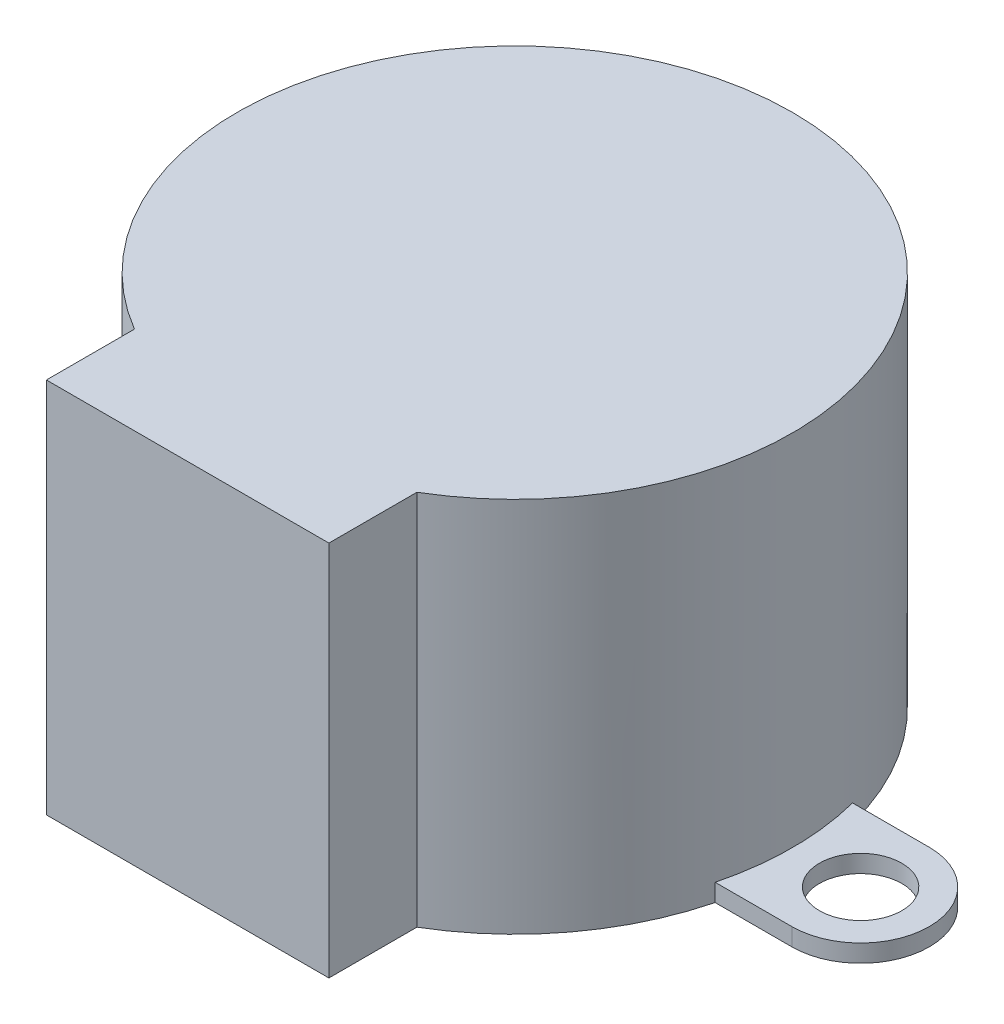
ISO-10303-21;
HEADER;
FILE_DESCRIPTION(('STEP AP214'),'2;1');
FILE_NAME('part.step','',(''),(''),'','','');
FILE_SCHEMA(('AUTOMOTIVE_DESIGN { 1 0 10303 214 1 1 1 1 }'));
ENDSEC;
DATA;
#1=APPLICATION_CONTEXT('core data for automotive mechanical design processes');
#2=APPLICATION_PROTOCOL_DEFINITION('international standard','automotive_design',2000,#1);
#3=PRODUCT_CONTEXT('',#1,'mechanical');
#4=PRODUCT('Part','Part','',(#3));
#5=PRODUCT_RELATED_PRODUCT_CATEGORY('part','',(#4));
#6=PRODUCT_DEFINITION_FORMATION('','',#4);
#7=PRODUCT_DEFINITION_CONTEXT('part definition',#1,'design');
#8=PRODUCT_DEFINITION('design','',#6,#7);
#9=PRODUCT_DEFINITION_SHAPE('','',#8);
#10=(LENGTH_UNIT() NAMED_UNIT(*) SI_UNIT(.MILLI.,.METRE.));
#11=(NAMED_UNIT(*) PLANE_ANGLE_UNIT() SI_UNIT($,.RADIAN.));
#12=(NAMED_UNIT(*) SI_UNIT($,.STERADIAN.) SOLID_ANGLE_UNIT());
#13=UNCERTAINTY_MEASURE_WITH_UNIT(LENGTH_MEASURE(1.E-05),#10,'distance_accuracy_value','');
#14=(GEOMETRIC_REPRESENTATION_CONTEXT(3) GLOBAL_UNCERTAINTY_ASSIGNED_CONTEXT((#13)) GLOBAL_UNIT_ASSIGNED_CONTEXT((#10,
#11,#12)) REPRESENTATION_CONTEXT('',''));
#15=CARTESIAN_POINT('',(0.,0.,0.));
#16=DIRECTION('',(0.,0.,1.));
#17=DIRECTION('',(1.,0.,0.));
#18=AXIS2_PLACEMENT_3D('',#15,#16,#17);
#19=CARTESIAN_POINT('',(0.,-2.3241,-8.03000000000002));
#20=DIRECTION('',(0.,-1.,0.));
#21=DIRECTION('',(0.,0.,-1.));
#22=AXIS2_PLACEMENT_3D('',#19,#20,#21);
#23=PLANE('',#22);
#24=DIRECTION('',(1.,0.,0.));
#25=VECTOR('',#24,1.);
#26=CARTESIAN_POINT('',(2.00176133380081,-2.3241,-9.50955000000002));
#27=LINE('',#26,#25);
#28=CARTESIAN_POINT('',(-2.00176133380081,-2.3241,-9.50955000000002));
#29=VERTEX_POINT('',#28);
#30=CARTESIAN_POINT('',(2.00176133380081,-2.3241,-9.50955000000002));
#31=VERTEX_POINT('',#30);
#32=EDGE_CURVE('E61',#29,#31,#27,.T.);
#33=ORIENTED_EDGE('',*,*,#32,.F.);
#34=CARTESIAN_POINT('',(0.,-2.3241,-8.03000000000002));
#35=DIRECTION('',(0.,-1.,0.));
#36=DIRECTION('',(0.,0.,-1.));
#37=AXIS2_PLACEMENT_3D('',#34,#35,#36);
#38=CIRCLE('',#37,2.4892);
#39=EDGE_CURVE('E186',#29,#31,#38,.T.);
#40=ORIENTED_EDGE('',*,*,#39,.T.);
#41=EDGE_LOOP('',(#33,#40));
#42=FACE_BOUND('',#41,.T.);
#43=ADVANCED_FACE('F45',(#42),#23,.T.);
#44=CARTESIAN_POINT('',(7.14375,19.05,12.0925125981948));
#45=DIRECTION('',(-1.,0.,0.));
#46=DIRECTION('',(0.,0.,1.));
#47=AXIS2_PLACEMENT_3D('',#44,#45,#46);
#48=PLANE('',#47);
#49=DIRECTION('',(0.,0.,-1.));
#50=VECTOR('',#49,1.);
#51=CARTESIAN_POINT('',(7.14375,0.,12.0925125981948));
#52=LINE('',#51,#50);
#53=CARTESIAN_POINT('',(7.14375000000001,0.,16.545));
#54=VERTEX_POINT('',#53);
#55=CARTESIAN_POINT('',(7.14375,0.,12.0925125981948));
#56=VERTEX_POINT('',#55);
#57=EDGE_CURVE('E291',#54,#56,#52,.T.);
#58=ORIENTED_EDGE('',*,*,#57,.T.);
#59=DIRECTION('',(0.,-1.,0.));
#60=VECTOR('',#59,1.);
#61=CARTESIAN_POINT('',(7.14375,19.05,12.0925125981948));
#62=LINE('',#61,#60);
#63=CARTESIAN_POINT('',(7.14375,19.05,12.0925125981948));
#64=VERTEX_POINT('',#63);
#65=EDGE_CURVE('E49',#64,#56,#62,.T.);
#66=ORIENTED_EDGE('',*,*,#65,.F.);
#67=DIRECTION('',(0.,0.,-1.));
#68=VECTOR('',#67,1.);
#69=CARTESIAN_POINT('',(7.14375,19.05,12.0925125981948));
#70=LINE('',#69,#68);
#71=CARTESIAN_POINT('',(7.14375000000001,19.05,16.545));
#72=VERTEX_POINT('',#71);
#73=EDGE_CURVE('E302',#72,#64,#70,.T.);
#74=ORIENTED_EDGE('',*,*,#73,.F.);
#75=DIRECTION('',(0.,-1.,0.));
#76=VECTOR('',#75,1.);
#77=CARTESIAN_POINT('',(7.14375000000001,19.05,16.545));
#78=LINE('',#77,#76);
#79=EDGE_CURVE('E316',#72,#54,#78,.T.);
#80=ORIENTED_EDGE('',*,*,#79,.T.);
#81=EDGE_LOOP('',(#58,#66,#74,#80));
#82=FACE_BOUND('',#81,.T.);
#83=ADVANCED_FACE('F47',(#82),#48,.F.);
#84=CARTESIAN_POINT('',(0.,19.05,0.));
#85=DIRECTION('',(0.,-1.,0.));
#86=DIRECTION('',(0.,0.,-1.));
#87=AXIS2_PLACEMENT_3D('',#84,#85,#86);
#88=CYLINDRICAL_SURFACE('',#87,14.045);
#89=CARTESIAN_POINT('',(0.,0.889,0.));
#90=DIRECTION('',(0.,1.,0.));
#91=DIRECTION('',(0.,0.,-1.));
#92=AXIS2_PLACEMENT_3D('',#89,#90,#91);
#93=CIRCLE('',#92,14.045);
#94=CARTESIAN_POINT('',(-13.6083209838687,0.889000000000001,-3.475));
#95=VERTEX_POINT('',#94);
#96=CARTESIAN_POINT('',(-13.6083209838687,0.889000000000001,3.475));
#97=VERTEX_POINT('',#96);
#98=EDGE_CURVE('E235',#95,#97,#93,.T.);
#99=ORIENTED_EDGE('',*,*,#98,.T.);
#100=DIRECTION('',(0.,-1.,0.));
#101=VECTOR('',#100,1.);
#102=CARTESIAN_POINT('',(-13.6083209838687,0.889,3.475));
#103=LINE('',#102,#101);
#104=CARTESIAN_POINT('',(-13.6083209838687,0.,3.475));
#105=VERTEX_POINT('',#104);
#106=EDGE_CURVE('E212',#97,#105,#103,.T.);
#107=ORIENTED_EDGE('',*,*,#106,.T.);
#108=CARTESIAN_POINT('',(0.,0.,0.));
#109=DIRECTION('',(0.,1.,0.));
#110=DIRECTION('',(0.,0.,-1.));
#111=AXIS2_PLACEMENT_3D('',#108,#109,#110);
#112=CIRCLE('',#111,14.045);
#113=CARTESIAN_POINT('',(-7.14375,0.,12.0925125981948));
#114=VERTEX_POINT('',#113);
#115=EDGE_CURVE('E320',#105,#114,#112,.T.);
#116=ORIENTED_EDGE('',*,*,#115,.T.);
#117=DIRECTION('',(0.,-1.,0.));
#118=VECTOR('',#117,1.);
#119=CARTESIAN_POINT('',(-7.14375,19.05,12.0925125981948));
#120=LINE('',#119,#118);
#121=CARTESIAN_POINT('',(-7.14375,19.05,12.0925125981948));
#122=VERTEX_POINT('',#121);
#123=EDGE_CURVE('E336',#122,#114,#120,.T.);
#124=ORIENTED_EDGE('',*,*,#123,.F.);
#125=CARTESIAN_POINT('',(0.,19.05,0.));
#126=DIRECTION('',(0.,1.,0.));
#127=DIRECTION('',(0.,0.,-1.));
#128=AXIS2_PLACEMENT_3D('',#125,#126,#127);
#129=CIRCLE('',#128,14.045);
#130=EDGE_CURVE('E306',#64,#122,#129,.T.);
#131=ORIENTED_EDGE('',*,*,#130,.F.);
#132=ORIENTED_EDGE('',*,*,#65,.T.);
#133=CARTESIAN_POINT('',(13.6083209838687,0.,3.475));
#134=VERTEX_POINT('',#133);
#135=EDGE_CURVE('E321',#56,#134,#112,.T.);
#136=ORIENTED_EDGE('',*,*,#135,.T.);
#137=DIRECTION('',(0.,-1.,0.));
#138=VECTOR('',#137,1.);
#139=CARTESIAN_POINT('',(13.6083209838687,0.889,3.475));
#140=LINE('',#139,#138);
#141=CARTESIAN_POINT('',(13.6083209838687,0.889000000000001,3.475));
#142=VERTEX_POINT('',#141);
#143=EDGE_CURVE('E296',#142,#134,#140,.T.);
#144=ORIENTED_EDGE('',*,*,#143,.F.);
#145=CARTESIAN_POINT('',(0.,0.889,0.));
#146=DIRECTION('',(0.,1.,0.));
#147=DIRECTION('',(0.,0.,1.));
#148=AXIS2_PLACEMENT_3D('',#145,#146,#147);
#149=CIRCLE('',#148,14.045);
#150=CARTESIAN_POINT('',(13.6083209838687,0.889000000000001,-3.475));
#151=VERTEX_POINT('',#150);
#152=EDGE_CURVE('E270',#142,#151,#149,.T.);
#153=ORIENTED_EDGE('',*,*,#152,.T.);
#154=DIRECTION('',(0.,-1.,0.));
#155=VECTOR('',#154,1.);
#156=CARTESIAN_POINT('',(13.6083209838687,0.889,-3.475));
#157=LINE('',#156,#155);
#158=CARTESIAN_POINT('',(13.6083209838687,0.,-3.475));
#159=VERTEX_POINT('',#158);
#160=EDGE_CURVE('E292',#151,#159,#157,.T.);
#161=ORIENTED_EDGE('',*,*,#160,.T.);
#162=CARTESIAN_POINT('',(-13.6083209838687,0.,-3.475));
#163=VERTEX_POINT('',#162);
#164=EDGE_CURVE('E325',#159,#163,#112,.T.);
#165=ORIENTED_EDGE('',*,*,#164,.T.);
#166=DIRECTION('',(0.,-1.,0.));
#167=VECTOR('',#166,1.);
#168=CARTESIAN_POINT('',(-13.6083209838687,0.889,-3.475));
#169=LINE('',#168,#167);
#170=EDGE_CURVE('E208',#95,#163,#169,.T.);
#171=ORIENTED_EDGE('',*,*,#170,.F.);
#172=EDGE_LOOP('',(#99,#107,#116,#124,#131,#132,#136,#144,#153,#161,#165,#171));
#173=FACE_BOUND('',#172,.T.);
#174=ADVANCED_FACE('F347',(#173),#88,.T.);
#175=CARTESIAN_POINT('',(-7.14375,19.05,12.0925125981948));
#176=DIRECTION('',(1.,0.,0.));
#177=DIRECTION('',(0.,0.,-1.));
#178=AXIS2_PLACEMENT_3D('',#175,#176,#177);
#179=PLANE('',#178);
#180=DIRECTION('',(0.,0.,1.));
#181=VECTOR('',#180,1.);
#182=CARTESIAN_POINT('',(-7.14375,0.,12.0925125981948));
#183=LINE('',#182,#181);
#184=CARTESIAN_POINT('',(-7.14374999999999,0.,16.545));
#185=VERTEX_POINT('',#184);
#186=EDGE_CURVE('E324',#114,#185,#183,.T.);
#187=ORIENTED_EDGE('',*,*,#186,.T.);
#188=DIRECTION('',(0.,-1.,0.));
#189=VECTOR('',#188,1.);
#190=CARTESIAN_POINT('',(-7.14374999999999,19.05,16.545));
#191=LINE('',#190,#189);
#192=CARTESIAN_POINT('',(-7.14374999999999,19.05,16.545));
#193=VERTEX_POINT('',#192);
#194=EDGE_CURVE('E333',#193,#185,#191,.T.);
#195=ORIENTED_EDGE('',*,*,#194,.F.);
#196=DIRECTION('',(0.,0.,1.));
#197=VECTOR('',#196,1.);
#198=CARTESIAN_POINT('',(-7.14375,19.05,12.0925125981948));
#199=LINE('',#198,#197);
#200=EDGE_CURVE('E310',#122,#193,#199,.T.);
#201=ORIENTED_EDGE('',*,*,#200,.F.);
#202=ORIENTED_EDGE('',*,*,#123,.T.);
#203=EDGE_LOOP('',(#187,#195,#201,#202));
#204=FACE_BOUND('',#203,.T.);
#205=ADVANCED_FACE('F447',(#204),#179,.F.);
#206=CARTESIAN_POINT('',(-7.14374999999999,19.05,16.545));
#207=DIRECTION('',(0.,0.,-1.));
#208=DIRECTION('',(-1.,0.,0.));
#209=AXIS2_PLACEMENT_3D('',#206,#207,#208);
#210=PLANE('',#209);
#211=DIRECTION('',(1.,0.,0.));
#212=VECTOR('',#211,1.);
#213=CARTESIAN_POINT('',(-7.14374999999999,0.,16.545));
#214=LINE('',#213,#212);
#215=EDGE_CURVE('E307',#185,#54,#214,.T.);
#216=ORIENTED_EDGE('',*,*,#215,.T.);
#217=ORIENTED_EDGE('',*,*,#79,.F.);
#218=DIRECTION('',(1.,0.,0.));
#219=VECTOR('',#218,1.);
#220=CARTESIAN_POINT('',(-7.14374999999999,19.05,16.545));
#221=LINE('',#220,#219);
#222=EDGE_CURVE('E313',#193,#72,#221,.T.);
#223=ORIENTED_EDGE('',*,*,#222,.F.);
#224=ORIENTED_EDGE('',*,*,#194,.T.);
#225=EDGE_LOOP('',(#216,#217,#223,#224));
#226=FACE_BOUND('',#225,.T.);
#227=ADVANCED_FACE('F441',(#226),#210,.F.);
#228=CARTESIAN_POINT('',(0.,19.05,0.));
#229=DIRECTION('',(0.,-1.,0.));
#230=DIRECTION('',(0.,0.,-1.));
#231=AXIS2_PLACEMENT_3D('',#228,#229,#230);
#232=PLANE('',#231);
#233=ORIENTED_EDGE('',*,*,#73,.T.);
#234=ORIENTED_EDGE('',*,*,#130,.T.);
#235=ORIENTED_EDGE('',*,*,#200,.T.);
#236=ORIENTED_EDGE('',*,*,#222,.T.);
#237=EDGE_LOOP('',(#233,#234,#235,#236));
#238=FACE_BOUND('',#237,.T.);
#239=ADVANCED_FACE('F433',(#238),#232,.F.);
#240=CARTESIAN_POINT('',(0.,0.,0.));
#241=DIRECTION('',(0.,-1.,0.));
#242=DIRECTION('',(0.,0.,-1.));
#243=AXIS2_PLACEMENT_3D('',#240,#241,#242);
#244=PLANE('',#243);
#245=CARTESIAN_POINT('',(0.,0.,-8.03000000000002));
#246=DIRECTION('',(0.,-1.,0.));
#247=DIRECTION('',(0.,0.,-1.));
#248=AXIS2_PLACEMENT_3D('',#245,#246,#247);
#249=CIRCLE('',#248,4.635);
#250=CARTESIAN_POINT('',(0.,0.,-3.39500000000002));
#251=VERTEX_POINT('',#250);
#252=EDGE_CURVE('E200',#251,#251,#249,.T.);
#253=ORIENTED_EDGE('',*,*,#252,.F.);
#254=EDGE_LOOP('',(#253));
#255=FACE_BOUND('',#254,.T.);
#256=ORIENTED_EDGE('',*,*,#57,.F.);
#257=ORIENTED_EDGE('',*,*,#215,.F.);
#258=ORIENTED_EDGE('',*,*,#186,.F.);
#259=ORIENTED_EDGE('',*,*,#115,.F.);
#260=DIRECTION('',(-1.,0.,0.));
#261=VECTOR('',#260,1.);
#262=CARTESIAN_POINT('',(-17.49,0.,3.475));
#263=LINE('',#262,#261);
#264=CARTESIAN_POINT('',(-17.49,0.,3.475));
#265=VERTEX_POINT('',#264);
#266=EDGE_CURVE('E218',#105,#265,#263,.T.);
#267=ORIENTED_EDGE('',*,*,#266,.T.);
#268=CARTESIAN_POINT('',(-17.49,0.,0.));
#269=DIRECTION('',(0.,-1.,0.));
#270=DIRECTION('',(0.,0.,-1.));
#271=AXIS2_PLACEMENT_3D('',#268,#269,#270);
#272=CIRCLE('',#271,3.475);
#273=CARTESIAN_POINT('',(-17.49,0.,-3.475));
#274=VERTEX_POINT('',#273);
#275=EDGE_CURVE('E227',#265,#274,#272,.T.);
#276=ORIENTED_EDGE('',*,*,#275,.T.);
#277=DIRECTION('',(1.,0.,0.));
#278=VECTOR('',#277,1.);
#279=CARTESIAN_POINT('',(-17.49,0.,-3.475));
#280=LINE('',#279,#278);
#281=EDGE_CURVE('E222',#274,#163,#280,.T.);
#282=ORIENTED_EDGE('',*,*,#281,.T.);
#283=ORIENTED_EDGE('',*,*,#164,.F.);
#284=DIRECTION('',(1.,0.,0.));
#285=VECTOR('',#284,1.);
#286=CARTESIAN_POINT('',(17.49,0.,-3.475));
#287=LINE('',#286,#285);
#288=CARTESIAN_POINT('',(17.49,0.,-3.475));
#289=VERTEX_POINT('',#288);
#290=EDGE_CURVE('E266',#159,#289,#287,.T.);
#291=ORIENTED_EDGE('',*,*,#290,.T.);
#292=CARTESIAN_POINT('',(17.49,0.,0.));
#293=DIRECTION('',(0.,-1.,0.));
#294=DIRECTION('',(0.,0.,1.));
#295=AXIS2_PLACEMENT_3D('',#292,#293,#294);
#296=CIRCLE('',#295,3.475);
#297=CARTESIAN_POINT('',(17.49,0.,3.475));
#298=VERTEX_POINT('',#297);
#299=EDGE_CURVE('E257',#289,#298,#296,.T.);
#300=ORIENTED_EDGE('',*,*,#299,.T.);
#301=DIRECTION('',(-1.,0.,0.));
#302=VECTOR('',#301,1.);
#303=CARTESIAN_POINT('',(17.49,0.,3.475));
#304=LINE('',#303,#302);
#305=EDGE_CURVE('E281',#298,#134,#304,.T.);
#306=ORIENTED_EDGE('',*,*,#305,.T.);
#307=ORIENTED_EDGE('',*,*,#135,.F.);
#308=EDGE_LOOP('',(#256,#257,#258,#259,#267,#276,#282,#283,#291,#300,#306,#307));
#309=FACE_BOUND('',#308,.T.);
#310=CARTESIAN_POINT('',(17.49,0.,0.));
#311=DIRECTION('',(0.,-1.,0.));
#312=DIRECTION('',(0.,0.,-1.));
#313=AXIS2_PLACEMENT_3D('',#310,#311,#312);
#314=CIRCLE('',#313,2.0828);
#315=CARTESIAN_POINT('',(17.49,0.,-2.08280000000001));
#316=VERTEX_POINT('',#315);
#317=EDGE_CURVE('E249',#316,#316,#314,.T.);
#318=ORIENTED_EDGE('',*,*,#317,.F.);
#319=EDGE_LOOP('',(#318));
#320=FACE_BOUND('',#319,.T.);
#321=CARTESIAN_POINT('',(-17.49,0.,0.));
#322=DIRECTION('',(0.,-1.,0.));
#323=DIRECTION('',(0.,0.,1.));
#324=AXIS2_PLACEMENT_3D('',#321,#322,#323);
#325=CIRCLE('',#324,2.0828);
#326=CARTESIAN_POINT('',(-17.49,0.,2.08279999999999));
#327=VERTEX_POINT('',#326);
#328=EDGE_CURVE('E245',#327,#327,#325,.T.);
#329=ORIENTED_EDGE('',*,*,#328,.F.);
#330=EDGE_LOOP('',(#329));
#331=FACE_BOUND('',#330,.T.);
#332=ADVANCED_FACE('F354',(#255,#309,#320,#331),#244,.T.);
#333=CARTESIAN_POINT('',(17.49,0.889,0.));
#334=DIRECTION('',(0.,-1.,0.));
#335=DIRECTION('',(0.,0.,-1.));
#336=AXIS2_PLACEMENT_3D('',#333,#334,#335);
#337=CYLINDRICAL_SURFACE('',#336,3.475);
#338=ORIENTED_EDGE('',*,*,#299,.F.);
#339=DIRECTION('',(0.,-1.,0.));
#340=VECTOR('',#339,1.);
#341=CARTESIAN_POINT('',(17.49,0.889,-3.475));
#342=LINE('',#341,#340);
#343=CARTESIAN_POINT('',(17.49,0.889,-3.475));
#344=VERTEX_POINT('',#343);
#345=EDGE_CURVE('E288',#344,#289,#342,.T.);
#346=ORIENTED_EDGE('',*,*,#345,.F.);
#347=CARTESIAN_POINT('',(17.49,0.889,0.));
#348=DIRECTION('',(0.,-1.,0.));
#349=DIRECTION('',(0.,0.,1.));
#350=AXIS2_PLACEMENT_3D('',#347,#348,#349);
#351=CIRCLE('',#350,3.475);
#352=CARTESIAN_POINT('',(17.49,0.889,3.475));
#353=VERTEX_POINT('',#352);
#354=EDGE_CURVE('E261',#344,#353,#351,.T.);
#355=ORIENTED_EDGE('',*,*,#354,.T.);
#356=DIRECTION('',(0.,-1.,0.));
#357=VECTOR('',#356,1.);
#358=CARTESIAN_POINT('',(17.49,0.889,3.475));
#359=LINE('',#358,#357);
#360=EDGE_CURVE('E277',#353,#298,#359,.T.);
#361=ORIENTED_EDGE('',*,*,#360,.T.);
#362=EDGE_LOOP('',(#338,#346,#355,#361));
#363=FACE_BOUND('',#362,.T.);
#364=ADVANCED_FACE('F432',(#363),#337,.T.);
#365=CARTESIAN_POINT('',(17.49,0.889,-3.475));
#366=DIRECTION('',(0.,0.,-1.));
#367=DIRECTION('',(-1.,0.,0.));
#368=AXIS2_PLACEMENT_3D('',#365,#366,#367);
#369=PLANE('',#368);
#370=ORIENTED_EDGE('',*,*,#290,.F.);
#371=ORIENTED_EDGE('',*,*,#160,.F.);
#372=DIRECTION('',(1.,0.,0.));
#373=VECTOR('',#372,1.);
#374=CARTESIAN_POINT('',(17.49,0.889,-3.475));
#375=LINE('',#374,#373);
#376=EDGE_CURVE('E273',#151,#344,#375,.T.);
#377=ORIENTED_EDGE('',*,*,#376,.T.);
#378=ORIENTED_EDGE('',*,*,#345,.T.);
#379=EDGE_LOOP('',(#370,#371,#377,#378));
#380=FACE_BOUND('',#379,.T.);
#381=ADVANCED_FACE('F369',(#380),#369,.T.);
#382=CARTESIAN_POINT('',(17.49,0.889,3.475));
#383=DIRECTION('',(0.,0.,1.));
#384=DIRECTION('',(1.,0.,0.));
#385=AXIS2_PLACEMENT_3D('',#382,#383,#384);
#386=PLANE('',#385);
#387=ORIENTED_EDGE('',*,*,#305,.F.);
#388=ORIENTED_EDGE('',*,*,#360,.F.);
#389=DIRECTION('',(-1.,0.,0.));
#390=VECTOR('',#389,1.);
#391=CARTESIAN_POINT('',(17.49,0.889,3.475));
#392=LINE('',#391,#390);
#393=EDGE_CURVE('E265',#353,#142,#392,.T.);
#394=ORIENTED_EDGE('',*,*,#393,.T.);
#395=ORIENTED_EDGE('',*,*,#143,.T.);
#396=EDGE_LOOP('',(#387,#388,#394,#395));
#397=FACE_BOUND('',#396,.T.);
#398=ADVANCED_FACE('F359',(#397),#386,.T.);
#399=CARTESIAN_POINT('',(17.49,0.889,0.));
#400=DIRECTION('',(0.,1.,0.));
#401=DIRECTION('',(0.,0.,1.));
#402=AXIS2_PLACEMENT_3D('',#399,#400,#401);
#403=PLANE('',#402);
#404=CARTESIAN_POINT('',(17.49,0.889,0.));
#405=DIRECTION('',(0.,-1.,0.));
#406=DIRECTION('',(0.,0.,-1.));
#407=AXIS2_PLACEMENT_3D('',#404,#405,#406);
#408=CIRCLE('',#407,2.0828);
#409=CARTESIAN_POINT('',(17.49,0.889,-2.08280000000001));
#410=VERTEX_POINT('',#409);
#411=EDGE_CURVE('E253',#410,#410,#408,.T.);
#412=ORIENTED_EDGE('',*,*,#411,.T.);
#413=EDGE_LOOP('',(#412));
#414=FACE_BOUND('',#413,.T.);
#415=ORIENTED_EDGE('',*,*,#354,.F.);
#416=ORIENTED_EDGE('',*,*,#376,.F.);
#417=ORIENTED_EDGE('',*,*,#152,.F.);
#418=ORIENTED_EDGE('',*,*,#393,.F.);
#419=EDGE_LOOP('',(#415,#416,#417,#418));
#420=FACE_BOUND('',#419,.T.);
#421=ADVANCED_FACE('F366',(#414,#420),#403,.T.);
#422=CARTESIAN_POINT('',(17.49,0.889,0.));
#423=DIRECTION('',(0.,-1.,0.));
#424=DIRECTION('',(0.,0.,-1.));
#425=AXIS2_PLACEMENT_3D('',#422,#423,#424);
#426=CYLINDRICAL_SURFACE('',#425,2.0828);
#427=ORIENTED_EDGE('',*,*,#411,.F.);
#428=EDGE_LOOP('',(#427));
#429=FACE_BOUND('',#428,.T.);
#430=ORIENTED_EDGE('',*,*,#317,.T.);
#431=EDGE_LOOP('',(#430));
#432=FACE_BOUND('',#431,.T.);
#433=ADVANCED_FACE('F394',(#429,#432),#426,.F.);
#434=CARTESIAN_POINT('',(-17.49,0.889,0.));
#435=DIRECTION('',(0.,-1.,0.));
#436=DIRECTION('',(0.,0.,-1.));
#437=AXIS2_PLACEMENT_3D('',#434,#435,#436);
#438=CYLINDRICAL_SURFACE('',#437,3.475);
#439=ORIENTED_EDGE('',*,*,#275,.F.);
#440=DIRECTION('',(0.,-1.,0.));
#441=VECTOR('',#440,1.);
#442=CARTESIAN_POINT('',(-17.49,0.889,3.475));
#443=LINE('',#442,#441);
#444=CARTESIAN_POINT('',(-17.49,0.889,3.475));
#445=VERTEX_POINT('',#444);
#446=EDGE_CURVE('E199',#445,#265,#443,.T.);
#447=ORIENTED_EDGE('',*,*,#446,.F.);
#448=CARTESIAN_POINT('',(-17.49,0.889,0.));
#449=DIRECTION('',(0.,-1.,0.));
#450=DIRECTION('',(0.,0.,-1.));
#451=AXIS2_PLACEMENT_3D('',#448,#449,#450);
#452=CIRCLE('',#451,3.475);
#453=CARTESIAN_POINT('',(-17.49,0.889,-3.475));
#454=VERTEX_POINT('',#453);
#455=EDGE_CURVE('E223',#445,#454,#452,.T.);
#456=ORIENTED_EDGE('',*,*,#455,.T.);
#457=DIRECTION('',(0.,-1.,0.));
#458=VECTOR('',#457,1.);
#459=CARTESIAN_POINT('',(-17.49,0.889,-3.475));
#460=LINE('',#459,#458);
#461=EDGE_CURVE('E204',#454,#274,#460,.T.);
#462=ORIENTED_EDGE('',*,*,#461,.T.);
#463=EDGE_LOOP('',(#439,#447,#456,#462));
#464=FACE_BOUND('',#463,.T.);
#465=ADVANCED_FACE('F379',(#464),#438,.T.);
#466=CARTESIAN_POINT('',(-17.49,0.889,3.475));
#467=DIRECTION('',(0.,0.,1.));
#468=DIRECTION('',(1.,0.,0.));
#469=AXIS2_PLACEMENT_3D('',#466,#467,#468);
#470=PLANE('',#469);
#471=ORIENTED_EDGE('',*,*,#266,.F.);
#472=ORIENTED_EDGE('',*,*,#106,.F.);
#473=DIRECTION('',(-1.,0.,0.));
#474=VECTOR('',#473,1.);
#475=CARTESIAN_POINT('',(-17.49,0.889,3.475));
#476=LINE('',#475,#474);
#477=EDGE_CURVE('E207',#97,#445,#476,.T.);
#478=ORIENTED_EDGE('',*,*,#477,.T.);
#479=ORIENTED_EDGE('',*,*,#446,.T.);
#480=EDGE_LOOP('',(#471,#472,#478,#479));
#481=FACE_BOUND('',#480,.T.);
#482=ADVANCED_FACE('F386',(#481),#470,.T.);
#483=CARTESIAN_POINT('',(-17.49,0.889,-3.475));
#484=DIRECTION('',(0.,0.,-1.));
#485=DIRECTION('',(-1.,0.,0.));
#486=AXIS2_PLACEMENT_3D('',#483,#484,#485);
#487=PLANE('',#486);
#488=ORIENTED_EDGE('',*,*,#281,.F.);
#489=ORIENTED_EDGE('',*,*,#461,.F.);
#490=DIRECTION('',(1.,0.,0.));
#491=VECTOR('',#490,1.);
#492=CARTESIAN_POINT('',(-17.49,0.889,-3.475));
#493=LINE('',#492,#491);
#494=EDGE_CURVE('E238',#454,#95,#493,.T.);
#495=ORIENTED_EDGE('',*,*,#494,.T.);
#496=ORIENTED_EDGE('',*,*,#170,.T.);
#497=EDGE_LOOP('',(#488,#489,#495,#496));
#498=FACE_BOUND('',#497,.T.);
#499=ADVANCED_FACE('F374',(#498),#487,.T.);
#500=CARTESIAN_POINT('',(-17.49,0.889,0.));
#501=DIRECTION('',(0.,-1.,0.));
#502=DIRECTION('',(0.,0.,-1.));
#503=AXIS2_PLACEMENT_3D('',#500,#501,#502);
#504=PLANE('',#503);
#505=CARTESIAN_POINT('',(-17.49,0.889,0.));
#506=DIRECTION('',(0.,-1.,0.));
#507=DIRECTION('',(0.,0.,1.));
#508=AXIS2_PLACEMENT_3D('',#505,#506,#507);
#509=CIRCLE('',#508,2.0828);
#510=CARTESIAN_POINT('',(-17.49,0.889,2.08279999999999));
#511=VERTEX_POINT('',#510);
#512=EDGE_CURVE('E231',#511,#511,#509,.T.);
#513=ORIENTED_EDGE('',*,*,#512,.T.);
#514=EDGE_LOOP('',(#513));
#515=FACE_BOUND('',#514,.T.);
#516=ORIENTED_EDGE('',*,*,#455,.F.);
#517=ORIENTED_EDGE('',*,*,#477,.F.);
#518=ORIENTED_EDGE('',*,*,#98,.F.);
#519=ORIENTED_EDGE('',*,*,#494,.F.);
#520=EDGE_LOOP('',(#516,#517,#518,#519));
#521=FACE_BOUND('',#520,.T.);
#522=ADVANCED_FACE('F382',(#515,#521),#504,.F.);
#523=CARTESIAN_POINT('',(-17.49,0.889,0.));
#524=DIRECTION('',(0.,-1.,0.));
#525=DIRECTION('',(0.,0.,-1.));
#526=AXIS2_PLACEMENT_3D('',#523,#524,#525);
#527=CYLINDRICAL_SURFACE('',#526,2.0828);
#528=ORIENTED_EDGE('',*,*,#512,.F.);
#529=EDGE_LOOP('',(#528));
#530=FACE_BOUND('',#529,.T.);
#531=ORIENTED_EDGE('',*,*,#328,.T.);
#532=EDGE_LOOP('',(#531));
#533=FACE_BOUND('',#532,.T.);
#534=ADVANCED_FACE('F420',(#530,#533),#527,.F.);
#535=CARTESIAN_POINT('',(0.,-1.524,-8.03000000000002));
#536=DIRECTION('',(0.,1.,0.));
#537=DIRECTION('',(0.,0.,1.));
#538=AXIS2_PLACEMENT_3D('',#535,#536,#537);
#539=CYLINDRICAL_SURFACE('',#538,4.635);
#540=CARTESIAN_POINT('',(0.,-1.524,-8.03000000000002));
#541=DIRECTION('',(0.,-1.,0.));
#542=DIRECTION('',(0.,0.,-1.));
#543=AXIS2_PLACEMENT_3D('',#540,#541,#542);
#544=CIRCLE('',#543,4.635);
#545=CARTESIAN_POINT('',(0.,-1.524,-3.39500000000002));
#546=VERTEX_POINT('',#545);
#547=EDGE_CURVE('E195',#546,#546,#544,.T.);
#548=CARTESIAN_POINT('',(0.,-1.524,-3.39500000000002));
#549=CARTESIAN_POINT('',(0.,-1.508125,-3.39500000000002));
#550=CARTESIAN_POINT('',(0.,-1.49225,-3.39500000000002));
#551=CARTESIAN_POINT('',(0.,-1.4605,-3.39500000000002));
#552=CARTESIAN_POINT('',(0.,-1.444625,-3.39500000000002));
#553=CARTESIAN_POINT('',(0.,-1.412875,-3.39500000000002));
#554=CARTESIAN_POINT('',(0.,-1.397,-3.39500000000002));
#555=CARTESIAN_POINT('',(0.,-1.36525,-3.39500000000002));
#556=CARTESIAN_POINT('',(0.,-1.349375,-3.39500000000002));
#557=CARTESIAN_POINT('',(0.,-1.317625,-3.39500000000002));
#558=CARTESIAN_POINT('',(0.,-1.30175,-3.39500000000002));
#559=CARTESIAN_POINT('',(0.,-1.27,-3.39500000000002));
#560=CARTESIAN_POINT('',(0.,-1.254125,-3.39500000000002));
#561=CARTESIAN_POINT('',(0.,-1.222375,-3.39500000000002));
#562=CARTESIAN_POINT('',(0.,-1.2065,-3.39500000000002));
#563=CARTESIAN_POINT('',(0.,-1.17475,-3.39500000000002));
#564=CARTESIAN_POINT('',(0.,-1.158875,-3.39500000000002));
#565=CARTESIAN_POINT('',(0.,-1.127125,-3.39500000000002));
#566=CARTESIAN_POINT('',(0.,-1.11125,-3.39500000000002));
#567=CARTESIAN_POINT('',(0.,-1.0795,-3.39500000000002));
#568=CARTESIAN_POINT('',(0.,-1.063625,-3.39500000000002));
#569=CARTESIAN_POINT('',(0.,-1.031875,-3.39500000000002));
#570=CARTESIAN_POINT('',(0.,-1.016,-3.39500000000002));
#571=CARTESIAN_POINT('',(0.,-0.98425,-3.39500000000002));
#572=CARTESIAN_POINT('',(0.,-0.968375,-3.39500000000002));
#573=CARTESIAN_POINT('',(0.,-0.936625,-3.39500000000002));
#574=CARTESIAN_POINT('',(0.,-0.92075,-3.39500000000002));
#575=CARTESIAN_POINT('',(0.,-0.889,-3.39500000000002));
#576=CARTESIAN_POINT('',(0.,-0.873125,-3.39500000000002));
#577=CARTESIAN_POINT('',(0.,-0.841375,-3.39500000000002));
#578=CARTESIAN_POINT('',(0.,-0.8255,-3.39500000000002));
#579=CARTESIAN_POINT('',(0.,-0.79375,-3.39500000000002));
#580=CARTESIAN_POINT('',(0.,-0.777875,-3.39500000000002));
#581=CARTESIAN_POINT('',(0.,-0.746125,-3.39500000000002));
#582=CARTESIAN_POINT('',(0.,-0.73025,-3.39500000000002));
#583=CARTESIAN_POINT('',(0.,-0.6985,-3.39500000000002));
#584=CARTESIAN_POINT('',(0.,-0.682625,-3.39500000000002));
#585=CARTESIAN_POINT('',(0.,-0.650875,-3.39500000000002));
#586=CARTESIAN_POINT('',(0.,-0.635,-3.39500000000002));
#587=CARTESIAN_POINT('',(0.,-0.60325,-3.39500000000002));
#588=CARTESIAN_POINT('',(0.,-0.587375,-3.39500000000002));
#589=CARTESIAN_POINT('',(0.,-0.555625,-3.39500000000002));
#590=CARTESIAN_POINT('',(0.,-0.53975,-3.39500000000002));
#591=CARTESIAN_POINT('',(0.,-0.508,-3.39500000000002));
#592=CARTESIAN_POINT('',(0.,-0.492125,-3.39500000000002));
#593=CARTESIAN_POINT('',(0.,-0.460375,-3.39500000000002));
#594=CARTESIAN_POINT('',(0.,-0.4445,-3.39500000000002));
#595=CARTESIAN_POINT('',(0.,-0.41275,-3.39500000000002));
#596=CARTESIAN_POINT('',(0.,-0.396875,-3.39500000000002));
#597=CARTESIAN_POINT('',(0.,-0.365125,-3.39500000000002));
#598=CARTESIAN_POINT('',(0.,-0.34925,-3.39500000000002));
#599=CARTESIAN_POINT('',(0.,-0.3175,-3.39500000000002));
#600=CARTESIAN_POINT('',(0.,-0.301625,-3.39500000000002));
#601=CARTESIAN_POINT('',(0.,-0.269875,-3.39500000000002));
#602=CARTESIAN_POINT('',(0.,-0.254,-3.39500000000002));
#603=CARTESIAN_POINT('',(0.,-0.22225,-3.39500000000002));
#604=CARTESIAN_POINT('',(0.,-0.206375,-3.39500000000002));
#605=CARTESIAN_POINT('',(0.,-0.174625,-3.39500000000002));
#606=CARTESIAN_POINT('',(0.,-0.15875,-3.39500000000002));
#607=CARTESIAN_POINT('',(0.,-0.127,-3.39500000000002));
#608=CARTESIAN_POINT('',(0.,-0.111125,-3.39500000000002));
#609=CARTESIAN_POINT('',(0.,-0.079375,-3.39500000000002));
#610=CARTESIAN_POINT('',(0.,-0.0635,-3.39500000000002));
#611=CARTESIAN_POINT('',(0.,-0.0317499999999999,-3.39500000000002));
#612=CARTESIAN_POINT('',(0.,-0.015875,-3.39500000000002));
#613=CARTESIAN_POINT('',(0.,0.,-3.39500000000002));
#614=B_SPLINE_CURVE_WITH_KNOTS('',3,(#548,#549,#550,#551,#552,#553,#554,#555,#556,#557,#558,
#559,#560,#561,#562,#563,#564,#565,#566,#567,#568,#569,#570,#571,#572,#573,#574,#575,#576,#577,
#578,#579,#580,#581,#582,#583,#584,#585,#586,#587,#588,#589,#590,#591,#592,#593,#594,#595,#596,
#597,#598,#599,#600,#601,#602,#603,#604,#605,#606,#607,#608,#609,#610,#611,#612,#613),
.UNSPECIFIED.,.F.,.F.,(4,2,2,2,2,2,2,2,2,2,2,2,2,2,2,2,2,2,2,2,2,2,2,2,2,2,2,2,2,2,2,2,4),(0.,
0.0476249999999999,0.0952499999999998,0.142875,0.1905,0.238125,0.28575,0.333375,0.381,0.428625,
0.47625,0.523875,0.5715,0.619125,0.66675,0.714375,0.762,0.809625,0.85725,0.904875,0.9525,
1.000125,1.04775,1.095375,1.143,1.190625,1.23825,1.285875,1.3335,1.381125,1.42875,1.476375,
1.524),.UNSPECIFIED.);
#615=EDGE_CURVE('BSEAM415',#546,#251,#614,.T.);
#616=ORIENTED_EDGE('',*,*,#547,.F.);
#617=ORIENTED_EDGE('',*,*,#252,.T.);
#618=ORIENTED_EDGE('',*,*,#615,.T.);
#619=ORIENTED_EDGE('',*,*,#615,.F.);
#620=EDGE_LOOP('',(#616,#618,#617,#619));
#621=FACE_BOUND('',#620,.T.);
#622=ADVANCED_FACE('F415',(#621),#539,.T.);
#623=CARTESIAN_POINT('',(0.,-1.524,-8.03000000000002));
#624=DIRECTION('',(0.,-1.,0.));
#625=DIRECTION('',(0.,0.,-1.));
#626=AXIS2_PLACEMENT_3D('',#623,#624,#625);
#627=PLANE('',#626);
#628=CARTESIAN_POINT('',(0.,-1.524,-8.03000000000002));
#629=DIRECTION('',(0.,-1.,0.));
#630=DIRECTION('',(0.,0.,-1.));
#631=AXIS2_PLACEMENT_3D('',#628,#629,#630);
#632=CIRCLE('',#631,2.4892);
#633=CARTESIAN_POINT('',(0.,-1.524,-10.5192));
#634=VERTEX_POINT('',#633);
#635=EDGE_CURVE('E11',#634,#634,#632,.T.);
#636=ORIENTED_EDGE('',*,*,#635,.F.);
#637=EDGE_LOOP('',(#636));
#638=FACE_BOUND('',#637,.T.);
#639=ORIENTED_EDGE('',*,*,#547,.T.);
#640=EDGE_LOOP('',(#639));
#641=FACE_BOUND('',#640,.T.);
#642=ADVANCED_FACE('F411',(#638,#641),#627,.T.);
#643=CARTESIAN_POINT('',(0.,-2.3241,-8.03000000000002));
#644=DIRECTION('',(0.,1.,0.));
#645=DIRECTION('',(0.,0.,1.));
#646=AXIS2_PLACEMENT_3D('',#643,#644,#645);
#647=CYLINDRICAL_SURFACE('',#646,2.4892);
#648=CARTESIAN_POINT('',(2.00176133380081,-2.3241,-6.55045000000002));
#649=VERTEX_POINT('',#648);
#650=CARTESIAN_POINT('',(-2.00176133380081,-2.3241,-6.55045000000002));
#651=VERTEX_POINT('',#650);
#652=EDGE_CURVE('E184',#649,#651,#38,.T.);
#653=ORIENTED_EDGE('',*,*,#652,.F.);
#654=DIRECTION('',(0.,1.,0.));
#655=VECTOR('',#654,1.);
#656=CARTESIAN_POINT('',(2.00176133380081,-8.5217,-6.55045000000002));
#657=LINE('',#656,#655);
#658=CARTESIAN_POINT('',(2.00176133380081,-8.5217,-6.55045000000002));
#659=VERTEX_POINT('',#658);
#660=EDGE_CURVE('E164',#659,#649,#657,.T.);
#661=ORIENTED_EDGE('',*,*,#660,.F.);
#662=CARTESIAN_POINT('',(0.,-8.5217,-8.03000000000002));
#663=DIRECTION('',(0.,-1.,0.));
#664=DIRECTION('',(0.,0.,1.));
#665=AXIS2_PLACEMENT_3D('',#662,#663,#664);
#666=CIRCLE('',#665,2.4892);
#667=CARTESIAN_POINT('',(2.00176133380081,-8.5217,-9.50955000000002));
#668=VERTEX_POINT('',#667);
#669=EDGE_CURVE('E171',#668,#659,#666,.T.);
#670=ORIENTED_EDGE('',*,*,#669,.F.);
#671=DIRECTION('',(0.,1.,0.));
#672=VECTOR('',#671,1.);
#673=CARTESIAN_POINT('',(2.00176133380081,-8.5217,-9.50955000000002));
#674=LINE('',#673,#672);
#675=EDGE_CURVE('E709',#668,#31,#674,.T.);
#676=ORIENTED_EDGE('',*,*,#675,.T.);
#677=ORIENTED_EDGE('',*,*,#39,.F.);
#678=DIRECTION('',(0.,1.,0.));
#679=VECTOR('',#678,1.);
#680=CARTESIAN_POINT('',(-2.00176133380081,-8.5217,-9.50955000000002));
#681=LINE('',#680,#679);
#682=CARTESIAN_POINT('',(-2.00176133380081,-8.5217,-9.50955000000002));
#683=VERTEX_POINT('',#682);
#684=EDGE_CURVE('E191',#683,#29,#681,.T.);
#685=ORIENTED_EDGE('',*,*,#684,.F.);
#686=CARTESIAN_POINT('',(0.,-8.5217,-8.03000000000002));
#687=DIRECTION('',(0.,-1.,0.));
#688=DIRECTION('',(0.,0.,-1.));
#689=AXIS2_PLACEMENT_3D('',#686,#687,#688);
#690=CIRCLE('',#689,2.4892);
#691=CARTESIAN_POINT('',(-2.00176133380081,-8.5217,-6.55045000000002));
#692=VERTEX_POINT('',#691);
#693=EDGE_CURVE('E170',#692,#683,#690,.T.);
#694=ORIENTED_EDGE('',*,*,#693,.F.);
#695=DIRECTION('',(0.,1.,0.));
#696=VECTOR('',#695,1.);
#697=CARTESIAN_POINT('',(-2.00176133380081,-8.5217,-6.55045000000002));
#698=LINE('',#697,#696);
#699=EDGE_CURVE('E166',#692,#651,#698,.T.);
#700=ORIENTED_EDGE('',*,*,#699,.T.);
#701=EDGE_LOOP('',(#653,#661,#670,#676,#677,#685,#694,#700));
#702=FACE_BOUND('',#701,.T.);
#703=ORIENTED_EDGE('',*,*,#635,.T.);
#704=EDGE_LOOP('',(#703));
#705=FACE_BOUND('',#704,.T.);
#706=ADVANCED_FACE('F182',(#702,#705),#647,.T.);
#707=DIRECTION('',(-1.,0.,0.));
#708=VECTOR('',#707,1.);
#709=CARTESIAN_POINT('',(-2.00176133380081,-2.3241,-6.55045000000002));
#710=LINE('',#709,#708);
#711=EDGE_CURVE('E68',#649,#651,#710,.T.);
#712=ORIENTED_EDGE('',*,*,#711,.F.);
#713=ORIENTED_EDGE('',*,*,#652,.T.);
#714=EDGE_LOOP('',(#712,#713));
#715=FACE_BOUND('',#714,.T.);
#716=ADVANCED_FACE('F399',(#715),#23,.T.);
#717=CARTESIAN_POINT('',(-2.00176133380081,-8.5217,-6.55045000000002));
#718=DIRECTION('',(0.,0.,-1.));
#719=DIRECTION('',(-1.,0.,0.));
#720=AXIS2_PLACEMENT_3D('',#717,#718,#719);
#721=PLANE('',#720);
#722=ORIENTED_EDGE('',*,*,#711,.T.);
#723=ORIENTED_EDGE('',*,*,#699,.F.);
#724=DIRECTION('',(-1.,0.,0.));
#725=VECTOR('',#724,1.);
#726=CARTESIAN_POINT('',(-2.00176133380081,-8.5217,-6.55045000000002));
#727=LINE('',#726,#725);
#728=EDGE_CURVE('E160',#659,#692,#727,.T.);
#729=ORIENTED_EDGE('',*,*,#728,.F.);
#730=ORIENTED_EDGE('',*,*,#660,.T.);
#731=EDGE_LOOP('',(#722,#723,#729,#730));
#732=FACE_BOUND('',#731,.T.);
#733=ADVANCED_FACE('F162',(#732),#721,.F.);
#734=CARTESIAN_POINT('',(2.00176133380081,-8.5217,-9.50955000000002));
#735=DIRECTION('',(0.,0.,1.));
#736=DIRECTION('',(1.,0.,0.));
#737=AXIS2_PLACEMENT_3D('',#734,#735,#736);
#738=PLANE('',#737);
#739=ORIENTED_EDGE('',*,*,#32,.T.);
#740=ORIENTED_EDGE('',*,*,#675,.F.);
#741=DIRECTION('',(1.,0.,0.));
#742=VECTOR('',#741,1.);
#743=CARTESIAN_POINT('',(2.00176133380081,-8.5217,-9.50955000000002));
#744=LINE('',#743,#742);
#745=EDGE_CURVE('E176',#683,#668,#744,.T.);
#746=ORIENTED_EDGE('',*,*,#745,.F.);
#747=ORIENTED_EDGE('',*,*,#684,.T.);
#748=EDGE_LOOP('',(#739,#740,#746,#747));
#749=FACE_BOUND('',#748,.T.);
#750=ADVANCED_FACE('F410',(#749),#738,.F.);
#751=CARTESIAN_POINT('',(0.,-8.5217,-8.03000000000002));
#752=DIRECTION('',(0.,1.,0.));
#753=DIRECTION('',(0.,0.,1.));
#754=AXIS2_PLACEMENT_3D('',#751,#752,#753);
#755=PLANE('',#754);
#756=ORIENTED_EDGE('',*,*,#669,.T.);
#757=ORIENTED_EDGE('',*,*,#728,.T.);
#758=ORIENTED_EDGE('',*,*,#693,.T.);
#759=ORIENTED_EDGE('',*,*,#745,.T.);
#760=EDGE_LOOP('',(#756,#757,#758,#759));
#761=FACE_BOUND('',#760,.T.);
#762=ADVANCED_FACE('F174',(#761),#755,.F.);
#763=CLOSED_SHELL('',(#43,#83,#174,#205,#227,#239,#332,#364,#381,#398,#421,#433,#465,#482,#499,
#522,#534,#622,#642,#706,#716,#733,#750,#762));
#764=MANIFOLD_SOLID_BREP('B2',#763);
#765=ADVANCED_BREP_SHAPE_REPRESENTATION('',(#18,#764),#14);
#766=SHAPE_DEFINITION_REPRESENTATION(#9,#765);
ENDSEC;
END-ISO-10303-21;
